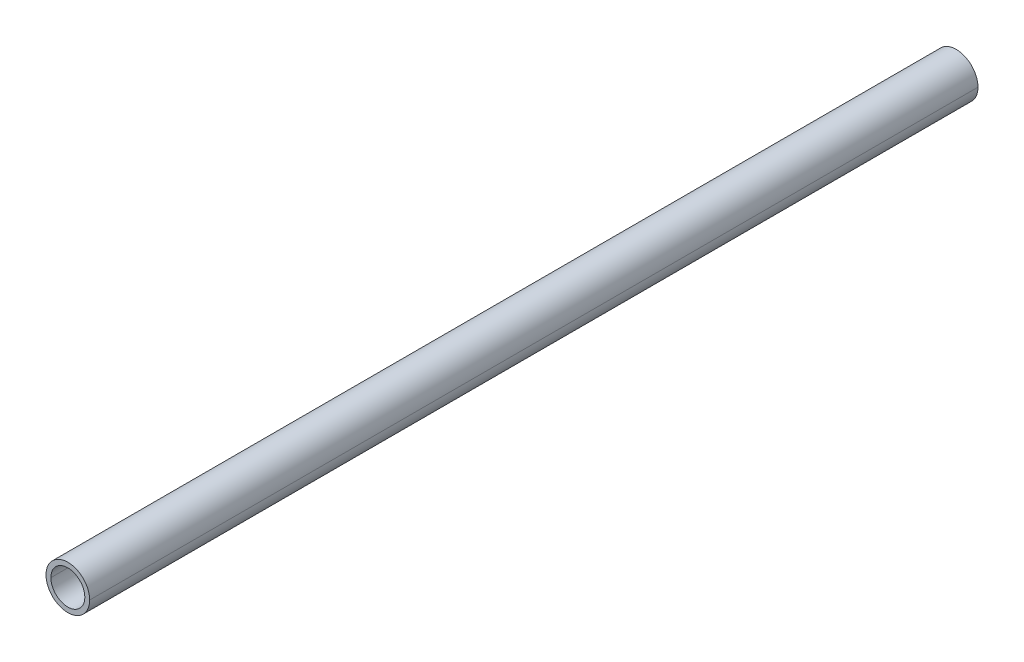
ISO-10303-21;
HEADER;
FILE_DESCRIPTION(('STEP AP214'),'2;1');
FILE_NAME('part.step','',(''),(''),'','','');
FILE_SCHEMA(('AUTOMOTIVE_DESIGN { 1 0 10303 214 1 1 1 1 }'));
ENDSEC;
DATA;
#1=APPLICATION_CONTEXT('core data for automotive mechanical design processes');
#2=APPLICATION_PROTOCOL_DEFINITION('international standard','automotive_design',2000,#1);
#3=PRODUCT_CONTEXT('',#1,'mechanical');
#4=PRODUCT('Part','Part','',(#3));
#5=PRODUCT_RELATED_PRODUCT_CATEGORY('part','',(#4));
#6=PRODUCT_DEFINITION_FORMATION('','',#4);
#7=PRODUCT_DEFINITION_CONTEXT('part definition',#1,'design');
#8=PRODUCT_DEFINITION('design','',#6,#7);
#9=PRODUCT_DEFINITION_SHAPE('','',#8);
#10=(LENGTH_UNIT() NAMED_UNIT(*) SI_UNIT(.MILLI.,.METRE.));
#11=(NAMED_UNIT(*) PLANE_ANGLE_UNIT() SI_UNIT($,.RADIAN.));
#12=(NAMED_UNIT(*) SI_UNIT($,.STERADIAN.) SOLID_ANGLE_UNIT());
#13=UNCERTAINTY_MEASURE_WITH_UNIT(LENGTH_MEASURE(1.E-05),#10,'distance_accuracy_value','');
#14=(GEOMETRIC_REPRESENTATION_CONTEXT(3) GLOBAL_UNCERTAINTY_ASSIGNED_CONTEXT((#13)) GLOBAL_UNIT_ASSIGNED_CONTEXT((#10,
#11,#12)) REPRESENTATION_CONTEXT('',''));
#15=CARTESIAN_POINT('',(0.,0.,0.));
#16=DIRECTION('',(0.,0.,1.));
#17=DIRECTION('',(1.,0.,0.));
#18=AXIS2_PLACEMENT_3D('',#15,#16,#17);
#19=CARTESIAN_POINT('',(0.,0.,366.18));
#20=DIRECTION('',(0.,0.,-1.));
#21=DIRECTION('',(-1.,0.,0.));
#22=AXIS2_PLACEMENT_3D('',#19,#20,#21);
#23=CYLINDRICAL_SURFACE('',#22,7.);
#24=DIRECTION('',(0.,0.,-1.));
#25=VECTOR('',#24,1.);
#26=CARTESIAN_POINT('',(7.,0.,366.18));
#27=LINE('',#26,#25);
#28=CARTESIAN_POINT('',(7.,0.,366.18));
#29=VERTEX_POINT('',#28);
#30=CARTESIAN_POINT('',(7.,0.,0.));
#31=VERTEX_POINT('',#30);
#32=EDGE_CURVE('E80',#29,#31,#27,.T.);
#33=ORIENTED_EDGE('',*,*,#32,.F.);
#34=CARTESIAN_POINT('',(0.,0.,366.18));
#35=DIRECTION('',(0.,0.,1.));
#36=DIRECTION('',(1.,0.,0.));
#37=AXIS2_PLACEMENT_3D('',#34,#35,#36);
#38=CIRCLE('',#37,7.);
#39=CARTESIAN_POINT('',(-7.,0.,366.18));
#40=VERTEX_POINT('',#39);
#41=EDGE_CURVE('E71',#29,#40,#38,.T.);
#42=ORIENTED_EDGE('',*,*,#41,.T.);
#43=DIRECTION('',(0.,0.,-1.));
#44=VECTOR('',#43,1.);
#45=CARTESIAN_POINT('',(-7.,0.,366.18));
#46=LINE('',#45,#44);
#47=CARTESIAN_POINT('',(-7.,0.,0.));
#48=VERTEX_POINT('',#47);
#49=EDGE_CURVE('E77',#40,#48,#46,.T.);
#50=ORIENTED_EDGE('',*,*,#49,.T.);
#51=CARTESIAN_POINT('',(0.,0.,0.));
#52=DIRECTION('',(0.,0.,1.));
#53=DIRECTION('',(1.,0.,0.));
#54=AXIS2_PLACEMENT_3D('',#51,#52,#53);
#55=CIRCLE('',#54,7.);
#56=EDGE_CURVE('E11',#31,#48,#55,.T.);
#57=ORIENTED_EDGE('',*,*,#56,.F.);
#58=EDGE_LOOP('',(#33,#42,#50,#57));
#59=FACE_BOUND('',#58,.T.);
#60=ADVANCED_FACE('F16',(#59),#23,.F.);
#61=CARTESIAN_POINT('',(0.,0.,366.18));
#62=DIRECTION('',(0.,0.,-1.));
#63=DIRECTION('',(-1.,0.,0.));
#64=AXIS2_PLACEMENT_3D('',#61,#62,#63);
#65=CYLINDRICAL_SURFACE('',#64,9.);
#66=DIRECTION('',(0.,0.,-1.));
#67=VECTOR('',#66,1.);
#68=CARTESIAN_POINT('',(9.,0.,366.18));
#69=LINE('',#68,#67);
#70=CARTESIAN_POINT('',(9.,0.,366.18));
#71=VERTEX_POINT('',#70);
#72=CARTESIAN_POINT('',(9.,0.,0.));
#73=VERTEX_POINT('',#72);
#74=EDGE_CURVE('E110',#71,#73,#69,.T.);
#75=ORIENTED_EDGE('',*,*,#74,.F.);
#76=CARTESIAN_POINT('',(0.,0.,366.18));
#77=DIRECTION('',(0.,0.,1.));
#78=DIRECTION('',(1.,0.,0.));
#79=AXIS2_PLACEMENT_3D('',#76,#77,#78);
#80=CIRCLE('',#79,9.);
#81=CARTESIAN_POINT('',(-9.,0.,366.18));
#82=VERTEX_POINT('',#81);
#83=EDGE_CURVE('E83',#82,#71,#80,.T.);
#84=ORIENTED_EDGE('',*,*,#83,.F.);
#85=DIRECTION('',(0.,0.,-1.));
#86=VECTOR('',#85,1.);
#87=CARTESIAN_POINT('',(-9.,0.,366.18));
#88=LINE('',#87,#86);
#89=CARTESIAN_POINT('',(-9.,0.,0.));
#90=VERTEX_POINT('',#89);
#91=EDGE_CURVE('E102',#82,#90,#88,.T.);
#92=ORIENTED_EDGE('',*,*,#91,.T.);
#93=CARTESIAN_POINT('',(0.,0.,0.));
#94=DIRECTION('',(0.,0.,1.));
#95=DIRECTION('',(1.,0.,0.));
#96=AXIS2_PLACEMENT_3D('',#93,#94,#95);
#97=CIRCLE('',#96,9.);
#98=EDGE_CURVE('E26',#90,#73,#97,.T.);
#99=ORIENTED_EDGE('',*,*,#98,.T.);
#100=EDGE_LOOP('',(#75,#84,#92,#99));
#101=FACE_BOUND('',#100,.T.);
#102=ADVANCED_FACE('F18',(#101),#65,.T.);
#103=CARTESIAN_POINT('',(0.,0.,0.));
#104=DIRECTION('',(0.,0.,1.));
#105=DIRECTION('',(1.,0.,0.));
#106=AXIS2_PLACEMENT_3D('',#103,#104,#105);
#107=PLANE('',#106);
#108=CARTESIAN_POINT('',(0.,0.,0.));
#109=DIRECTION('',(0.,0.,1.));
#110=DIRECTION('',(1.,0.,0.));
#111=AXIS2_PLACEMENT_3D('',#108,#109,#110);
#112=CIRCLE('',#111,7.);
#113=EDGE_CURVE('E88',#48,#31,#112,.T.);
#114=ORIENTED_EDGE('',*,*,#113,.T.);
#115=ORIENTED_EDGE('',*,*,#56,.T.);
#116=EDGE_LOOP('',(#114,#115));
#117=FACE_BOUND('',#116,.T.);
#118=ORIENTED_EDGE('',*,*,#98,.F.);
#119=CARTESIAN_POINT('',(0.,0.,0.));
#120=DIRECTION('',(0.,0.,1.));
#121=DIRECTION('',(1.,0.,0.));
#122=AXIS2_PLACEMENT_3D('',#119,#120,#121);
#123=CIRCLE('',#122,9.);
#124=EDGE_CURVE('E107',#73,#90,#123,.T.);
#125=ORIENTED_EDGE('',*,*,#124,.F.);
#126=EDGE_LOOP('',(#118,#125));
#127=FACE_BOUND('',#126,.T.);
#128=ADVANCED_FACE('F114',(#117,#127),#107,.F.);
#129=CARTESIAN_POINT('',(0.,0.,366.18));
#130=DIRECTION('',(0.,0.,1.));
#131=DIRECTION('',(1.,0.,0.));
#132=AXIS2_PLACEMENT_3D('',#129,#130,#131);
#133=PLANE('',#132);
#134=CARTESIAN_POINT('',(0.,0.,366.18));
#135=DIRECTION('',(0.,0.,1.));
#136=DIRECTION('',(1.,0.,0.));
#137=AXIS2_PLACEMENT_3D('',#134,#135,#136);
#138=CIRCLE('',#137,7.);
#139=EDGE_CURVE('E87',#40,#29,#138,.T.);
#140=ORIENTED_EDGE('',*,*,#139,.F.);
#141=ORIENTED_EDGE('',*,*,#41,.F.);
#142=EDGE_LOOP('',(#140,#141));
#143=FACE_BOUND('',#142,.T.);
#144=ORIENTED_EDGE('',*,*,#83,.T.);
#145=CARTESIAN_POINT('',(0.,0.,366.18));
#146=DIRECTION('',(0.,0.,1.));
#147=DIRECTION('',(1.,0.,0.));
#148=AXIS2_PLACEMENT_3D('',#145,#146,#147);
#149=CIRCLE('',#148,9.);
#150=EDGE_CURVE('E90',#71,#82,#149,.T.);
#151=ORIENTED_EDGE('',*,*,#150,.T.);
#152=EDGE_LOOP('',(#144,#151));
#153=FACE_BOUND('',#152,.T.);
#154=ADVANCED_FACE('F92',(#143,#153),#133,.T.);
#155=CARTESIAN_POINT('',(0.,0.,366.18));
#156=DIRECTION('',(0.,0.,-1.));
#157=DIRECTION('',(-1.,0.,0.));
#158=AXIS2_PLACEMENT_3D('',#155,#156,#157);
#159=CYLINDRICAL_SURFACE('',#158,9.);
#160=ORIENTED_EDGE('',*,*,#150,.F.);
#161=ORIENTED_EDGE('',*,*,#74,.T.);
#162=ORIENTED_EDGE('',*,*,#124,.T.);
#163=ORIENTED_EDGE('',*,*,#91,.F.);
#164=EDGE_LOOP('',(#160,#161,#162,#163));
#165=FACE_BOUND('',#164,.T.);
#166=ADVANCED_FACE('F121',(#165),#159,.T.);
#167=CARTESIAN_POINT('',(0.,0.,366.18));
#168=DIRECTION('',(0.,0.,-1.));
#169=DIRECTION('',(-1.,0.,0.));
#170=AXIS2_PLACEMENT_3D('',#167,#168,#169);
#171=CYLINDRICAL_SURFACE('',#170,7.);
#172=ORIENTED_EDGE('',*,*,#139,.T.);
#173=ORIENTED_EDGE('',*,*,#32,.T.);
#174=ORIENTED_EDGE('',*,*,#113,.F.);
#175=ORIENTED_EDGE('',*,*,#49,.F.);
#176=EDGE_LOOP('',(#172,#173,#174,#175));
#177=FACE_BOUND('',#176,.T.);
#178=ADVANCED_FACE('F86',(#177),#171,.F.);
#179=CLOSED_SHELL('',(#60,#102,#128,#154,#166,#178));
#180=MANIFOLD_SOLID_BREP('B1',#179);
#181=ADVANCED_BREP_SHAPE_REPRESENTATION('',(#18,#180),#14);
#182=SHAPE_DEFINITION_REPRESENTATION(#9,#181);
ENDSEC;
END-ISO-10303-21;
